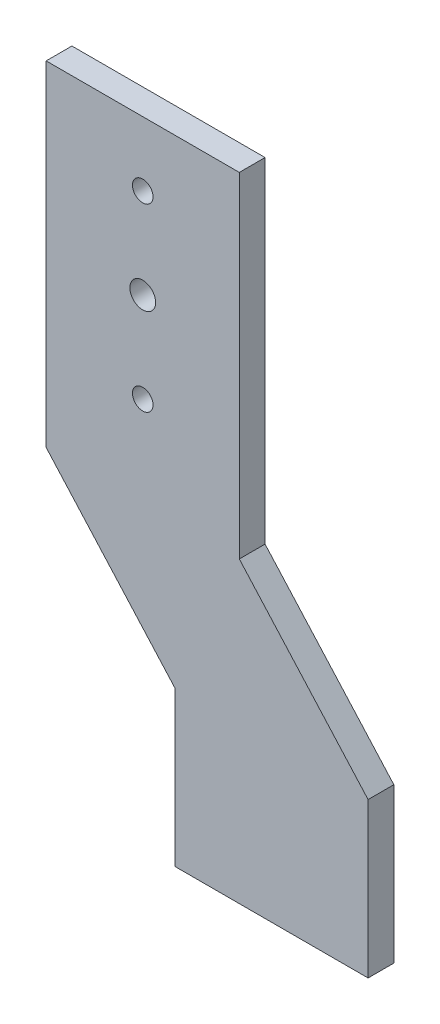
ISO-10303-21;
HEADER;
FILE_DESCRIPTION(('STEP AP214'),'2;1');
FILE_NAME('part.step','',(''),(''),'','','');
FILE_SCHEMA(('AUTOMOTIVE_DESIGN { 1 0 10303 214 1 1 1 1 }'));
ENDSEC;
DATA;
#1=APPLICATION_CONTEXT('core data for automotive mechanical design processes');
#2=APPLICATION_PROTOCOL_DEFINITION('international standard','automotive_design',2000,#1);
#3=PRODUCT_CONTEXT('',#1,'mechanical');
#4=PRODUCT('Part','Part','',(#3));
#5=PRODUCT_RELATED_PRODUCT_CATEGORY('part','',(#4));
#6=PRODUCT_DEFINITION_FORMATION('','',#4);
#7=PRODUCT_DEFINITION_CONTEXT('part definition',#1,'design');
#8=PRODUCT_DEFINITION('design','',#6,#7);
#9=PRODUCT_DEFINITION_SHAPE('','',#8);
#10=(LENGTH_UNIT() NAMED_UNIT(*) SI_UNIT(.MILLI.,.METRE.));
#11=(NAMED_UNIT(*) PLANE_ANGLE_UNIT() SI_UNIT($,.RADIAN.));
#12=(NAMED_UNIT(*) SI_UNIT($,.STERADIAN.) SOLID_ANGLE_UNIT());
#13=UNCERTAINTY_MEASURE_WITH_UNIT(LENGTH_MEASURE(1.E-05),#10,'distance_accuracy_value','');
#14=(GEOMETRIC_REPRESENTATION_CONTEXT(3) GLOBAL_UNCERTAINTY_ASSIGNED_CONTEXT((#13)) GLOBAL_UNIT_ASSIGNED_CONTEXT((#10,
#11,#12)) REPRESENTATION_CONTEXT('',''));
#15=CARTESIAN_POINT('',(0.,0.,0.));
#16=DIRECTION('',(0.,0.,1.));
#17=DIRECTION('',(1.,0.,0.));
#18=AXIS2_PLACEMENT_3D('',#15,#16,#17);
#19=CARTESIAN_POINT('',(0.,0.,0.));
#20=DIRECTION('',(0.,0.,-1.));
#21=DIRECTION('',(-1.,0.,0.));
#22=AXIS2_PLACEMENT_3D('',#19,#20,#21);
#23=PLANE('',#22);
#24=CARTESIAN_POINT('',(37.5,185.901699437495,0.));
#25=DIRECTION('',(0.,0.,1.));
#26=DIRECTION('',(1.,0.,0.));
#27=AXIS2_PLACEMENT_3D('',#24,#25,#26);
#28=CIRCLE('',#27,5.);
#29=CARTESIAN_POINT('',(42.5,185.901699437495,0.));
#30=VERTEX_POINT('',#29);
#31=EDGE_CURVE('E227',#30,#30,#28,.T.);
#32=ORIENTED_EDGE('',*,*,#31,.T.);
#33=EDGE_LOOP('',(#32));
#34=FACE_BOUND('',#33,.T.);
#35=CARTESIAN_POINT('',(37.5,220.901699437495,0.));
#36=DIRECTION('',(0.,0.,1.));
#37=DIRECTION('',(1.,0.,0.));
#38=AXIS2_PLACEMENT_3D('',#35,#36,#37);
#39=CIRCLE('',#38,4.);
#40=CARTESIAN_POINT('',(41.5,220.901699437495,0.));
#41=VERTEX_POINT('',#40);
#42=EDGE_CURVE('E219',#41,#41,#39,.T.);
#43=ORIENTED_EDGE('',*,*,#42,.T.);
#44=EDGE_LOOP('',(#43));
#45=FACE_BOUND('',#44,.T.);
#46=DIRECTION('',(0.,-1.,0.));
#47=VECTOR('',#46,1.);
#48=CARTESIAN_POINT('',(0.,115.901699437495,0.));
#49=LINE('',#48,#47);
#50=CARTESIAN_POINT('',(0.,245.901699437495,0.));
#51=VERTEX_POINT('',#50);
#52=CARTESIAN_POINT('',(0.,115.901699437495,0.));
#53=VERTEX_POINT('',#52);
#54=EDGE_CURVE('E145',#51,#53,#49,.T.);
#55=ORIENTED_EDGE('',*,*,#54,.F.);
#56=DIRECTION('',(-1.,0.,0.));
#57=VECTOR('',#56,1.);
#58=CARTESIAN_POINT('',(0.,245.901699437495,0.));
#59=LINE('',#58,#57);
#60=CARTESIAN_POINT('',(75.,245.901699437495,0.));
#61=VERTEX_POINT('',#60);
#62=EDGE_CURVE('E96',#61,#51,#59,.T.);
#63=ORIENTED_EDGE('',*,*,#62,.F.);
#64=DIRECTION('',(0.,1.,0.));
#65=VECTOR('',#64,1.);
#66=CARTESIAN_POINT('',(75.,245.901699437495,0.));
#67=LINE('',#66,#65);
#68=CARTESIAN_POINT('',(75.,115.901699437495,0.));
#69=VERTEX_POINT('',#68);
#70=EDGE_CURVE('E90',#69,#61,#67,.T.);
#71=ORIENTED_EDGE('',*,*,#70,.F.);
#72=DIRECTION('',(-0.666666666666667,0.74535599249993,0.));
#73=VECTOR('',#72,1.);
#74=CARTESIAN_POINT('',(75.,115.901699437495,0.));
#75=LINE('',#74,#73);
#76=CARTESIAN_POINT('',(125.,60.,0.));
#77=VERTEX_POINT('',#76);
#78=EDGE_CURVE('E132',#77,#69,#75,.T.);
#79=ORIENTED_EDGE('',*,*,#78,.F.);
#80=DIRECTION('',(0.,1.,0.));
#81=VECTOR('',#80,1.);
#82=CARTESIAN_POINT('',(125.,60.,0.));
#83=LINE('',#82,#81);
#84=CARTESIAN_POINT('',(125.,0.,0.));
#85=VERTEX_POINT('',#84);
#86=EDGE_CURVE('E159',#85,#77,#83,.T.);
#87=ORIENTED_EDGE('',*,*,#86,.F.);
#88=DIRECTION('',(1.,0.,0.));
#89=VECTOR('',#88,1.);
#90=CARTESIAN_POINT('',(125.,0.,0.));
#91=LINE('',#90,#89);
#92=CARTESIAN_POINT('',(50.,0.,0.));
#93=VERTEX_POINT('',#92);
#94=EDGE_CURVE('E156',#93,#85,#91,.T.);
#95=ORIENTED_EDGE('',*,*,#94,.F.);
#96=DIRECTION('',(0.,-1.,0.));
#97=VECTOR('',#96,1.);
#98=CARTESIAN_POINT('',(50.,0.,0.));
#99=LINE('',#98,#97);
#100=CARTESIAN_POINT('',(50.,60.,0.));
#101=VERTEX_POINT('',#100);
#102=EDGE_CURVE('E153',#101,#93,#99,.T.);
#103=ORIENTED_EDGE('',*,*,#102,.F.);
#104=DIRECTION('',(0.666666666666667,-0.74535599249993,0.));
#105=VECTOR('',#104,1.);
#106=CARTESIAN_POINT('',(50.,60.,0.));
#107=LINE('',#106,#105);
#108=EDGE_CURVE('E149',#53,#101,#107,.T.);
#109=ORIENTED_EDGE('',*,*,#108,.F.);
#110=EDGE_LOOP('',(#55,#63,#71,#79,#87,#95,#103,#109));
#111=FACE_BOUND('',#110,.T.);
#112=CARTESIAN_POINT('',(37.5,150.901699437495,0.));
#113=DIRECTION('',(0.,0.,1.));
#114=DIRECTION('',(1.,0.,0.));
#115=AXIS2_PLACEMENT_3D('',#112,#113,#114);
#116=CIRCLE('',#115,4.);
#117=CARTESIAN_POINT('',(41.5,150.901699437495,0.));
#118=VERTEX_POINT('',#117);
#119=EDGE_CURVE('E150',#118,#118,#116,.T.);
#120=ORIENTED_EDGE('',*,*,#119,.T.);
#121=EDGE_LOOP('',(#120));
#122=FACE_BOUND('',#121,.T.);
#123=ADVANCED_FACE('F43',(#34,#45,#111,#122),#23,.T.);
#124=CARTESIAN_POINT('',(0.,115.901699437495,10.));
#125=DIRECTION('',(1.,0.,0.));
#126=DIRECTION('',(0.,1.,0.));
#127=AXIS2_PLACEMENT_3D('',#124,#125,#126);
#128=PLANE('',#127);
#129=ORIENTED_EDGE('',*,*,#54,.T.);
#130=DIRECTION('',(0.,0.,-1.));
#131=VECTOR('',#130,1.);
#132=CARTESIAN_POINT('',(0.,115.901699437495,10.));
#133=LINE('',#132,#131);
#134=CARTESIAN_POINT('',(0.,115.901699437495,10.));
#135=VERTEX_POINT('',#134);
#136=EDGE_CURVE('E11',#135,#53,#133,.T.);
#137=ORIENTED_EDGE('',*,*,#136,.F.);
#138=DIRECTION('',(0.,-1.,0.));
#139=VECTOR('',#138,1.);
#140=CARTESIAN_POINT('',(0.,115.901699437495,10.));
#141=LINE('',#140,#139);
#142=CARTESIAN_POINT('',(0.,245.901699437495,10.));
#143=VERTEX_POINT('',#142);
#144=EDGE_CURVE('E168',#143,#135,#141,.T.);
#145=ORIENTED_EDGE('',*,*,#144,.F.);
#146=DIRECTION('',(0.,0.,-1.));
#147=VECTOR('',#146,1.);
#148=CARTESIAN_POINT('',(0.,245.901699437495,10.));
#149=LINE('',#148,#147);
#150=EDGE_CURVE('E141',#143,#51,#149,.T.);
#151=ORIENTED_EDGE('',*,*,#150,.T.);
#152=EDGE_LOOP('',(#129,#137,#145,#151));
#153=FACE_BOUND('',#152,.T.);
#154=ADVANCED_FACE('F45',(#153),#128,.F.);
#155=CARTESIAN_POINT('',(50.,60.,10.));
#156=DIRECTION('',(0.74535599249993,0.666666666666667,0.));
#157=DIRECTION('',(-0.666666666666667,0.74535599249993,0.));
#158=AXIS2_PLACEMENT_3D('',#155,#156,#157);
#159=PLANE('',#158);
#160=ORIENTED_EDGE('',*,*,#108,.T.);
#161=DIRECTION('',(0.,0.,-1.));
#162=VECTOR('',#161,1.);
#163=CARTESIAN_POINT('',(50.,60.,10.));
#164=LINE('',#163,#162);
#165=CARTESIAN_POINT('',(50.,60.,10.));
#166=VERTEX_POINT('',#165);
#167=EDGE_CURVE('E53',#166,#101,#164,.T.);
#168=ORIENTED_EDGE('',*,*,#167,.F.);
#169=DIRECTION('',(0.666666666666667,-0.74535599249993,0.));
#170=VECTOR('',#169,1.);
#171=CARTESIAN_POINT('',(50.,60.,10.));
#172=LINE('',#171,#170);
#173=EDGE_CURVE('E104',#135,#166,#172,.T.);
#174=ORIENTED_EDGE('',*,*,#173,.F.);
#175=ORIENTED_EDGE('',*,*,#136,.T.);
#176=EDGE_LOOP('',(#160,#168,#174,#175));
#177=FACE_BOUND('',#176,.T.);
#178=ADVANCED_FACE('F263',(#177),#159,.F.);
#179=CARTESIAN_POINT('',(50.,0.,10.));
#180=DIRECTION('',(1.,0.,0.));
#181=DIRECTION('',(0.,0.,-1.));
#182=AXIS2_PLACEMENT_3D('',#179,#180,#181);
#183=PLANE('',#182);
#184=ORIENTED_EDGE('',*,*,#102,.T.);
#185=DIRECTION('',(0.,0.,-1.));
#186=VECTOR('',#185,1.);
#187=CARTESIAN_POINT('',(50.,0.,10.));
#188=LINE('',#187,#186);
#189=CARTESIAN_POINT('',(50.,0.,10.));
#190=VERTEX_POINT('',#189);
#191=EDGE_CURVE('E179',#190,#93,#188,.T.);
#192=ORIENTED_EDGE('',*,*,#191,.F.);
#193=DIRECTION('',(0.,-1.,0.));
#194=VECTOR('',#193,1.);
#195=CARTESIAN_POINT('',(50.,0.,10.));
#196=LINE('',#195,#194);
#197=EDGE_CURVE('E189',#166,#190,#196,.T.);
#198=ORIENTED_EDGE('',*,*,#197,.F.);
#199=ORIENTED_EDGE('',*,*,#167,.T.);
#200=EDGE_LOOP('',(#184,#192,#198,#199));
#201=FACE_BOUND('',#200,.T.);
#202=ADVANCED_FACE('F187',(#201),#183,.F.);
#203=CARTESIAN_POINT('',(125.,0.,10.));
#204=DIRECTION('',(0.,1.,0.));
#205=DIRECTION('',(-1.,0.,0.));
#206=AXIS2_PLACEMENT_3D('',#203,#204,#205);
#207=PLANE('',#206);
#208=ORIENTED_EDGE('',*,*,#94,.T.);
#209=DIRECTION('',(0.,0.,-1.));
#210=VECTOR('',#209,1.);
#211=CARTESIAN_POINT('',(125.,0.,10.));
#212=LINE('',#211,#210);
#213=CARTESIAN_POINT('',(125.,0.,10.));
#214=VERTEX_POINT('',#213);
#215=EDGE_CURVE('E175',#214,#85,#212,.T.);
#216=ORIENTED_EDGE('',*,*,#215,.F.);
#217=DIRECTION('',(1.,0.,0.));
#218=VECTOR('',#217,1.);
#219=CARTESIAN_POINT('',(125.,0.,10.));
#220=LINE('',#219,#218);
#221=EDGE_CURVE('E202',#190,#214,#220,.T.);
#222=ORIENTED_EDGE('',*,*,#221,.F.);
#223=ORIENTED_EDGE('',*,*,#191,.T.);
#224=EDGE_LOOP('',(#208,#216,#222,#223));
#225=FACE_BOUND('',#224,.T.);
#226=ADVANCED_FACE('F197',(#225),#207,.F.);
#227=CARTESIAN_POINT('',(125.,60.,10.));
#228=DIRECTION('',(-1.,0.,0.));
#229=DIRECTION('',(0.,-1.,0.));
#230=AXIS2_PLACEMENT_3D('',#227,#228,#229);
#231=PLANE('',#230);
#232=ORIENTED_EDGE('',*,*,#86,.T.);
#233=DIRECTION('',(0.,0.,-1.));
#234=VECTOR('',#233,1.);
#235=CARTESIAN_POINT('',(125.,60.,10.));
#236=LINE('',#235,#234);
#237=CARTESIAN_POINT('',(125.,60.,10.));
#238=VERTEX_POINT('',#237);
#239=EDGE_CURVE('E134',#238,#77,#236,.T.);
#240=ORIENTED_EDGE('',*,*,#239,.F.);
#241=DIRECTION('',(0.,1.,0.));
#242=VECTOR('',#241,1.);
#243=CARTESIAN_POINT('',(125.,60.,10.));
#244=LINE('',#243,#242);
#245=EDGE_CURVE('E123',#214,#238,#244,.T.);
#246=ORIENTED_EDGE('',*,*,#245,.F.);
#247=ORIENTED_EDGE('',*,*,#215,.T.);
#248=EDGE_LOOP('',(#232,#240,#246,#247));
#249=FACE_BOUND('',#248,.T.);
#250=ADVANCED_FACE('F200',(#249),#231,.F.);
#251=CARTESIAN_POINT('',(75.,115.901699437495,10.));
#252=DIRECTION('',(-0.74535599249993,-0.666666666666667,0.));
#253=DIRECTION('',(0.666666666666667,-0.74535599249993,0.));
#254=AXIS2_PLACEMENT_3D('',#251,#252,#253);
#255=PLANE('',#254);
#256=ORIENTED_EDGE('',*,*,#78,.T.);
#257=DIRECTION('',(0.,0.,-1.));
#258=VECTOR('',#257,1.);
#259=CARTESIAN_POINT('',(75.,115.901699437495,10.));
#260=LINE('',#259,#258);
#261=CARTESIAN_POINT('',(75.,115.901699437495,10.));
#262=VERTEX_POINT('',#261);
#263=EDGE_CURVE('E129',#262,#69,#260,.T.);
#264=ORIENTED_EDGE('',*,*,#263,.F.);
#265=DIRECTION('',(-0.666666666666667,0.74535599249993,0.));
#266=VECTOR('',#265,1.);
#267=CARTESIAN_POINT('',(75.,115.901699437495,10.));
#268=LINE('',#267,#266);
#269=EDGE_CURVE('E117',#238,#262,#268,.T.);
#270=ORIENTED_EDGE('',*,*,#269,.F.);
#271=ORIENTED_EDGE('',*,*,#239,.T.);
#272=EDGE_LOOP('',(#256,#264,#270,#271));
#273=FACE_BOUND('',#272,.T.);
#274=ADVANCED_FACE('F130',(#273),#255,.F.);
#275=CARTESIAN_POINT('',(75.,245.901699437495,10.));
#276=DIRECTION('',(-1.,0.,0.));
#277=DIRECTION('',(0.,0.,1.));
#278=AXIS2_PLACEMENT_3D('',#275,#276,#277);
#279=PLANE('',#278);
#280=ORIENTED_EDGE('',*,*,#70,.T.);
#281=DIRECTION('',(0.,0.,-1.));
#282=VECTOR('',#281,1.);
#283=CARTESIAN_POINT('',(75.,245.901699437495,10.));
#284=LINE('',#283,#282);
#285=CARTESIAN_POINT('',(75.,245.901699437495,10.));
#286=VERTEX_POINT('',#285);
#287=EDGE_CURVE('E135',#286,#61,#284,.T.);
#288=ORIENTED_EDGE('',*,*,#287,.F.);
#289=DIRECTION('',(0.,1.,0.));
#290=VECTOR('',#289,1.);
#291=CARTESIAN_POINT('',(75.,245.901699437495,10.));
#292=LINE('',#291,#290);
#293=EDGE_CURVE('E121',#262,#286,#292,.T.);
#294=ORIENTED_EDGE('',*,*,#293,.F.);
#295=ORIENTED_EDGE('',*,*,#263,.T.);
#296=EDGE_LOOP('',(#280,#288,#294,#295));
#297=FACE_BOUND('',#296,.T.);
#298=ADVANCED_FACE('F137',(#297),#279,.F.);
#299=CARTESIAN_POINT('',(0.,245.901699437495,10.));
#300=DIRECTION('',(0.,-1.,0.));
#301=DIRECTION('',(0.,0.,-1.));
#302=AXIS2_PLACEMENT_3D('',#299,#300,#301);
#303=PLANE('',#302);
#304=ORIENTED_EDGE('',*,*,#62,.T.);
#305=ORIENTED_EDGE('',*,*,#150,.F.);
#306=DIRECTION('',(-1.,0.,0.));
#307=VECTOR('',#306,1.);
#308=CARTESIAN_POINT('',(0.,245.901699437495,10.));
#309=LINE('',#308,#307);
#310=EDGE_CURVE('E61',#286,#143,#309,.T.);
#311=ORIENTED_EDGE('',*,*,#310,.F.);
#312=ORIENTED_EDGE('',*,*,#287,.T.);
#313=EDGE_LOOP('',(#304,#305,#311,#312));
#314=FACE_BOUND('',#313,.T.);
#315=ADVANCED_FACE('F241',(#314),#303,.F.);
#316=CARTESIAN_POINT('',(0.,0.,10.));
#317=DIRECTION('',(0.,0.,-1.));
#318=DIRECTION('',(-1.,0.,0.));
#319=AXIS2_PLACEMENT_3D('',#316,#317,#318);
#320=PLANE('',#319);
#321=CARTESIAN_POINT('',(37.5,185.901699437495,10.));
#322=DIRECTION('',(0.,0.,1.));
#323=DIRECTION('',(1.,0.,0.));
#324=AXIS2_PLACEMENT_3D('',#321,#322,#323);
#325=CIRCLE('',#324,4.99999999999999);
#326=CARTESIAN_POINT('',(42.5,185.901699437495,10.));
#327=VERTEX_POINT('',#326);
#328=EDGE_CURVE('E231',#327,#327,#325,.T.);
#329=ORIENTED_EDGE('',*,*,#328,.F.);
#330=EDGE_LOOP('',(#329));
#331=FACE_BOUND('',#330,.T.);
#332=CARTESIAN_POINT('',(37.5,220.901699437495,10.));
#333=DIRECTION('',(0.,0.,1.));
#334=DIRECTION('',(1.,0.,0.));
#335=AXIS2_PLACEMENT_3D('',#332,#333,#334);
#336=CIRCLE('',#335,3.99999999999999);
#337=CARTESIAN_POINT('',(41.5,220.901699437495,10.));
#338=VERTEX_POINT('',#337);
#339=EDGE_CURVE('E223',#338,#338,#336,.T.);
#340=ORIENTED_EDGE('',*,*,#339,.F.);
#341=EDGE_LOOP('',(#340));
#342=FACE_BOUND('',#341,.T.);
#343=CARTESIAN_POINT('',(37.5,150.901699437495,10.));
#344=DIRECTION('',(0.,0.,1.));
#345=DIRECTION('',(1.,0.,0.));
#346=AXIS2_PLACEMENT_3D('',#343,#344,#345);
#347=CIRCLE('',#346,3.99999999999999);
#348=CARTESIAN_POINT('',(41.5,150.901699437495,10.));
#349=VERTEX_POINT('',#348);
#350=EDGE_CURVE('E215',#349,#349,#347,.T.);
#351=ORIENTED_EDGE('',*,*,#350,.F.);
#352=EDGE_LOOP('',(#351));
#353=FACE_BOUND('',#352,.T.);
#354=ORIENTED_EDGE('',*,*,#144,.T.);
#355=ORIENTED_EDGE('',*,*,#173,.T.);
#356=ORIENTED_EDGE('',*,*,#197,.T.);
#357=ORIENTED_EDGE('',*,*,#221,.T.);
#358=ORIENTED_EDGE('',*,*,#245,.T.);
#359=ORIENTED_EDGE('',*,*,#269,.T.);
#360=ORIENTED_EDGE('',*,*,#293,.T.);
#361=ORIENTED_EDGE('',*,*,#310,.T.);
#362=EDGE_LOOP('',(#354,#355,#356,#357,#358,#359,#360,#361));
#363=FACE_BOUND('',#362,.T.);
#364=ADVANCED_FACE('F119',(#331,#342,#353,#363),#320,.F.);
#365=CARTESIAN_POINT('',(37.5,150.901699437495,10.));
#366=DIRECTION('',(0.,0.,1.));
#367=DIRECTION('',(1.,0.,0.));
#368=AXIS2_PLACEMENT_3D('',#365,#366,#367);
#369=CYLINDRICAL_SURFACE('',#368,3.99999999999999);
#370=ORIENTED_EDGE('',*,*,#119,.F.);
#371=EDGE_LOOP('',(#370));
#372=FACE_BOUND('',#371,.T.);
#373=ORIENTED_EDGE('',*,*,#350,.T.);
#374=EDGE_LOOP('',(#373));
#375=FACE_BOUND('',#374,.T.);
#376=ADVANCED_FACE('F240',(#372,#375),#369,.F.);
#377=CARTESIAN_POINT('',(37.5,220.901699437495,10.));
#378=DIRECTION('',(0.,0.,1.));
#379=DIRECTION('',(1.,0.,0.));
#380=AXIS2_PLACEMENT_3D('',#377,#378,#379);
#381=CYLINDRICAL_SURFACE('',#380,3.99999999999999);
#382=ORIENTED_EDGE('',*,*,#42,.F.);
#383=EDGE_LOOP('',(#382));
#384=FACE_BOUND('',#383,.T.);
#385=ORIENTED_EDGE('',*,*,#339,.T.);
#386=EDGE_LOOP('',(#385));
#387=FACE_BOUND('',#386,.T.);
#388=ADVANCED_FACE('F248',(#384,#387),#381,.F.);
#389=CARTESIAN_POINT('',(37.5,185.901699437495,10.));
#390=DIRECTION('',(0.,0.,1.));
#391=DIRECTION('',(1.,0.,0.));
#392=AXIS2_PLACEMENT_3D('',#389,#390,#391);
#393=CYLINDRICAL_SURFACE('',#392,4.99999999999999);
#394=ORIENTED_EDGE('',*,*,#31,.F.);
#395=EDGE_LOOP('',(#394));
#396=FACE_BOUND('',#395,.T.);
#397=ORIENTED_EDGE('',*,*,#328,.T.);
#398=EDGE_LOOP('',(#397));
#399=FACE_BOUND('',#398,.T.);
#400=ADVANCED_FACE('F236',(#396,#399),#393,.F.);
#401=CLOSED_SHELL('',(#123,#154,#178,#202,#226,#250,#274,#298,#315,#364,#376,#388,#400));
#402=MANIFOLD_SOLID_BREP('B2',#401);
#403=ADVANCED_BREP_SHAPE_REPRESENTATION('',(#18,#402),#14);
#404=SHAPE_DEFINITION_REPRESENTATION(#9,#403);
ENDSEC;
END-ISO-10303-21;
